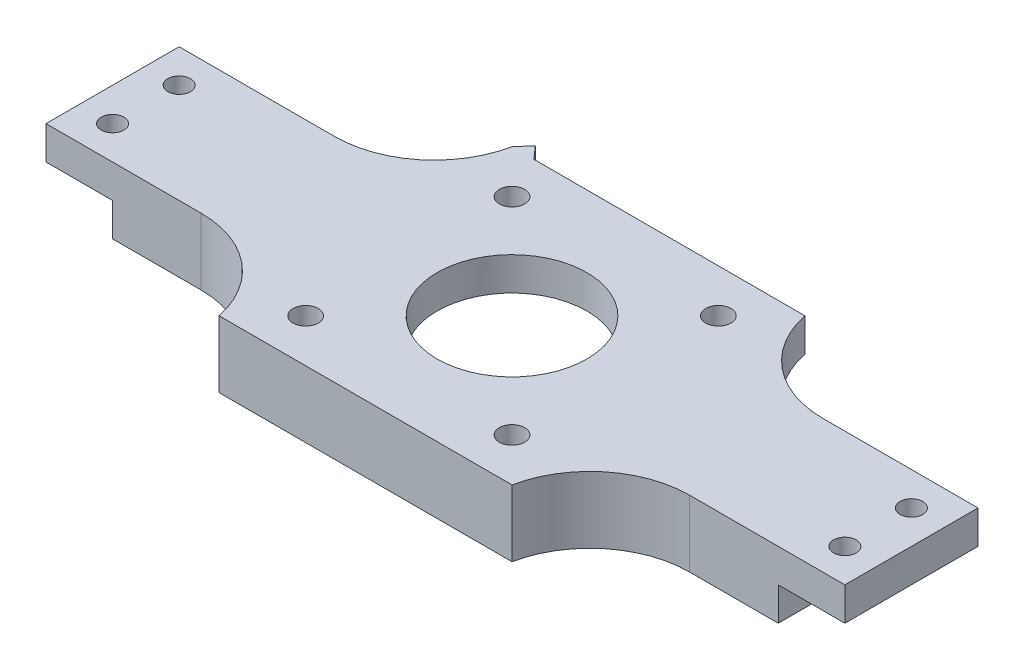
ISO-10303-21;
HEADER;
FILE_DESCRIPTION(('STEP AP214'),'2;1');
FILE_NAME('part.step','',(''),(''),'','','');
FILE_SCHEMA(('AUTOMOTIVE_DESIGN { 1 0 10303 214 1 1 1 1 }'));
ENDSEC;
DATA;
#1=APPLICATION_CONTEXT('core data for automotive mechanical design processes');
#2=APPLICATION_PROTOCOL_DEFINITION('international standard','automotive_design',2000,#1);
#3=PRODUCT_CONTEXT('',#1,'mechanical');
#4=PRODUCT('Part','Part','',(#3));
#5=PRODUCT_RELATED_PRODUCT_CATEGORY('part','',(#4));
#6=PRODUCT_DEFINITION_FORMATION('','',#4);
#7=PRODUCT_DEFINITION_CONTEXT('part definition',#1,'design');
#8=PRODUCT_DEFINITION('design','',#6,#7);
#9=PRODUCT_DEFINITION_SHAPE('','',#8);
#10=(LENGTH_UNIT() NAMED_UNIT(*) SI_UNIT(.MILLI.,.METRE.));
#11=(NAMED_UNIT(*) PLANE_ANGLE_UNIT() SI_UNIT($,.RADIAN.));
#12=(NAMED_UNIT(*) SI_UNIT($,.STERADIAN.) SOLID_ANGLE_UNIT());
#13=UNCERTAINTY_MEASURE_WITH_UNIT(LENGTH_MEASURE(1.E-05),#10,'distance_accuracy_value','');
#14=(GEOMETRIC_REPRESENTATION_CONTEXT(3) GLOBAL_UNCERTAINTY_ASSIGNED_CONTEXT((#13)) GLOBAL_UNIT_ASSIGNED_CONTEXT((#10,
#11,#12)) REPRESENTATION_CONTEXT('',''));
#15=CARTESIAN_POINT('',(0.,0.,0.));
#16=DIRECTION('',(0.,0.,1.));
#17=DIRECTION('',(1.,0.,0.));
#18=AXIS2_PLACEMENT_3D('',#15,#16,#17);
#19=CARTESIAN_POINT('',(22.,10.,4.8));
#20=DIRECTION('',(0.,0.,-1.));
#21=DIRECTION('',(-1.,0.,0.));
#22=AXIS2_PLACEMENT_3D('',#19,#20,#21);
#23=PLANE('',#22);
#24=DIRECTION('',(0.,1.,0.));
#25=VECTOR('',#24,1.);
#26=CARTESIAN_POINT('',(50.,10.,4.8));
#27=LINE('',#26,#25);
#28=CARTESIAN_POINT('',(50.,0.,4.8));
#29=VERTEX_POINT('',#28);
#30=CARTESIAN_POINT('',(50.,5.,4.8));
#31=VERTEX_POINT('',#30);
#32=EDGE_CURVE('E459',#29,#31,#27,.T.);
#33=ORIENTED_EDGE('',*,*,#32,.T.);
#34=DIRECTION('',(1.,0.,0.));
#35=VECTOR('',#34,1.);
#36=CARTESIAN_POINT('',(22.,5.,4.8));
#37=LINE('',#36,#35);
#38=CARTESIAN_POINT('',(60.,5.,4.8));
#39=VERTEX_POINT('',#38);
#40=EDGE_CURVE('E465',#31,#39,#37,.T.);
#41=ORIENTED_EDGE('',*,*,#40,.T.);
#42=DIRECTION('',(0.,-1.,0.));
#43=VECTOR('',#42,1.);
#44=CARTESIAN_POINT('',(60.,10.,4.8));
#45=LINE('',#44,#43);
#46=CARTESIAN_POINT('',(60.,10.,4.8));
#47=VERTEX_POINT('',#46);
#48=EDGE_CURVE('E316',#47,#39,#45,.T.);
#49=ORIENTED_EDGE('',*,*,#48,.F.);
#50=DIRECTION('',(1.,0.,0.));
#51=VECTOR('',#50,1.);
#52=CARTESIAN_POINT('',(22.,10.,4.8));
#53=LINE('',#52,#51);
#54=CARTESIAN_POINT('',(36.6969384566991,10.,4.8));
#55=VERTEX_POINT('',#54);
#56=EDGE_CURVE('E267',#55,#47,#53,.T.);
#57=ORIENTED_EDGE('',*,*,#56,.F.);
#58=DIRECTION('',(0.,-1.,0.));
#59=VECTOR('',#58,1.);
#60=CARTESIAN_POINT('',(36.6969384566991,10.,4.8));
#61=LINE('',#60,#59);
#62=CARTESIAN_POINT('',(36.6969384566991,0.,4.8));
#63=VERTEX_POINT('',#62);
#64=EDGE_CURVE('E326',#55,#63,#61,.T.);
#65=ORIENTED_EDGE('',*,*,#64,.T.);
#66=DIRECTION('',(1.,0.,0.));
#67=VECTOR('',#66,1.);
#68=CARTESIAN_POINT('',(22.,0.,4.8));
#69=LINE('',#68,#67);
#70=EDGE_CURVE('E266',#63,#29,#69,.T.);
#71=ORIENTED_EDGE('',*,*,#70,.T.);
#72=EDGE_LOOP('',(#33,#41,#49,#57,#65,#71));
#73=FACE_BOUND('',#72,.T.);
#74=ADVANCED_FACE('F37',(#73),#23,.F.);
#75=CARTESIAN_POINT('',(60.,10.,4.8));
#76=DIRECTION('',(-1.,0.,0.));
#77=DIRECTION('',(0.,0.,1.));
#78=AXIS2_PLACEMENT_3D('',#75,#76,#77);
#79=PLANE('',#78);
#80=ORIENTED_EDGE('',*,*,#48,.T.);
#81=DIRECTION('',(0.,0.,-1.));
#82=VECTOR('',#81,1.);
#83=CARTESIAN_POINT('',(60.,5.,16.8));
#84=LINE('',#83,#82);
#85=CARTESIAN_POINT('',(60.,5.,-15.2));
#86=VERTEX_POINT('',#85);
#87=EDGE_CURVE('E446',#39,#86,#84,.T.);
#88=ORIENTED_EDGE('',*,*,#87,.T.);
#89=DIRECTION('',(0.,-1.,0.));
#90=VECTOR('',#89,1.);
#91=CARTESIAN_POINT('',(60.,10.,-15.2));
#92=LINE('',#91,#90);
#93=CARTESIAN_POINT('',(60.,10.,-15.2));
#94=VERTEX_POINT('',#93);
#95=EDGE_CURVE('E313',#94,#86,#92,.T.);
#96=ORIENTED_EDGE('',*,*,#95,.F.);
#97=DIRECTION('',(0.,0.,-1.));
#98=VECTOR('',#97,1.);
#99=CARTESIAN_POINT('',(60.,10.,4.8));
#100=LINE('',#99,#98);
#101=EDGE_CURVE('E269',#47,#94,#100,.T.);
#102=ORIENTED_EDGE('',*,*,#101,.F.);
#103=EDGE_LOOP('',(#80,#88,#96,#102));
#104=FACE_BOUND('',#103,.T.);
#105=ADVANCED_FACE('F490',(#104),#79,.F.);
#106=CARTESIAN_POINT('',(60.,10.,-15.2));
#107=DIRECTION('',(0.,0.,1.));
#108=DIRECTION('',(1.,0.,0.));
#109=AXIS2_PLACEMENT_3D('',#106,#107,#108);
#110=PLANE('',#109);
#111=DIRECTION('',(-1.,0.,0.));
#112=VECTOR('',#111,1.);
#113=CARTESIAN_POINT('',(60.,0.,-15.2));
#114=LINE('',#113,#112);
#115=CARTESIAN_POINT('',(50.,0.,-15.2));
#116=VERTEX_POINT('',#115);
#117=CARTESIAN_POINT('',(36.3068699208122,0.,-15.2));
#118=VERTEX_POINT('',#117);
#119=EDGE_CURVE('E289',#116,#118,#114,.T.);
#120=ORIENTED_EDGE('',*,*,#119,.T.);
#121=DIRECTION('',(0.,1.,0.));
#122=VECTOR('',#121,1.);
#123=CARTESIAN_POINT('',(36.3068699208122,5.,-15.2));
#124=LINE('',#123,#122);
#125=CARTESIAN_POINT('',(36.3068699208122,5.,-15.2));
#126=VERTEX_POINT('',#125);
#127=EDGE_CURVE('E396',#118,#126,#124,.T.);
#128=ORIENTED_EDGE('',*,*,#127,.T.);
#129=DIRECTION('',(-1.,0.,0.));
#130=VECTOR('',#129,1.);
#131=CARTESIAN_POINT('',(60.,5.,-15.2));
#132=LINE('',#131,#130);
#133=CARTESIAN_POINT('',(36.6969384566991,5.,-15.2));
#134=VERTEX_POINT('',#133);
#135=EDGE_CURVE('E468',#134,#126,#132,.T.);
#136=ORIENTED_EDGE('',*,*,#135,.F.);
#137=DIRECTION('',(0.,1.,0.));
#138=VECTOR('',#137,1.);
#139=CARTESIAN_POINT('',(36.6969384566991,10.,-15.2));
#140=LINE('',#139,#138);
#141=CARTESIAN_POINT('',(36.6969384566991,10.,-15.2));
#142=VERTEX_POINT('',#141);
#143=EDGE_CURVE('E329',#134,#142,#140,.T.);
#144=ORIENTED_EDGE('',*,*,#143,.T.);
#145=DIRECTION('',(-1.,0.,0.));
#146=VECTOR('',#145,1.);
#147=CARTESIAN_POINT('',(60.,10.,-15.2));
#148=LINE('',#147,#146);
#149=EDGE_CURVE('E272',#94,#142,#148,.T.);
#150=ORIENTED_EDGE('',*,*,#149,.F.);
#151=ORIENTED_EDGE('',*,*,#95,.T.);
#152=DIRECTION('',(-1.,0.,0.));
#153=VECTOR('',#152,1.);
#154=CARTESIAN_POINT('',(60.,5.,-15.2));
#155=LINE('',#154,#153);
#156=CARTESIAN_POINT('',(50.,5.,-15.2));
#157=VERTEX_POINT('',#156);
#158=EDGE_CURVE('E357',#86,#157,#155,.T.);
#159=ORIENTED_EDGE('',*,*,#158,.T.);
#160=DIRECTION('',(0.,-1.,0.));
#161=VECTOR('',#160,1.);
#162=CARTESIAN_POINT('',(50.,10.,-15.2));
#163=LINE('',#162,#161);
#164=EDGE_CURVE('E448',#157,#116,#163,.T.);
#165=ORIENTED_EDGE('',*,*,#164,.T.);
#166=EDGE_LOOP('',(#120,#128,#136,#144,#150,#151,#159,#165));
#167=FACE_BOUND('',#166,.T.);
#168=ADVANCED_FACE('F474',(#167),#110,.F.);
#169=CARTESIAN_POINT('',(-22.,10.,-27.2));
#170=DIRECTION('',(0.,0.,1.));
#171=DIRECTION('',(1.,0.,0.));
#172=AXIS2_PLACEMENT_3D('',#169,#170,#171);
#173=PLANE('',#172);
#174=DIRECTION('',(-1.,0.,0.));
#175=VECTOR('',#174,1.);
#176=CARTESIAN_POINT('',(-22.,5.,-27.2));
#177=LINE('',#176,#175);
#178=CARTESIAN_POINT('',(22.,5.,-27.2));
#179=VERTEX_POINT('',#178);
#180=CARTESIAN_POINT('',(-18.7207327581259,5.,-27.2));
#181=VERTEX_POINT('',#180);
#182=EDGE_CURVE('E227',#179,#181,#177,.T.);
#183=ORIENTED_EDGE('',*,*,#182,.T.);
#184=DIRECTION('',(0.,1.,0.));
#185=VECTOR('',#184,1.);
#186=CARTESIAN_POINT('',(-18.7207327581259,5.,-27.2));
#187=LINE('',#186,#185);
#188=CARTESIAN_POINT('',(-18.7207327581259,10.,-27.2));
#189=VERTEX_POINT('',#188);
#190=EDGE_CURVE('E209',#181,#189,#187,.T.);
#191=ORIENTED_EDGE('',*,*,#190,.T.);
#192=DIRECTION('',(-1.,0.,0.));
#193=VECTOR('',#192,1.);
#194=CARTESIAN_POINT('',(0.,10.,-27.2));
#195=LINE('',#194,#193);
#196=CARTESIAN_POINT('',(22.,10.,-27.2));
#197=VERTEX_POINT('',#196);
#198=EDGE_CURVE('E275',#197,#189,#195,.T.);
#199=ORIENTED_EDGE('',*,*,#198,.F.);
#200=DIRECTION('',(0.,-1.,0.));
#201=VECTOR('',#200,1.);
#202=CARTESIAN_POINT('',(22.,10.,-27.2));
#203=LINE('',#202,#201);
#204=EDGE_CURVE('E234',#197,#179,#203,.T.);
#205=ORIENTED_EDGE('',*,*,#204,.T.);
#206=EDGE_LOOP('',(#183,#191,#199,#205));
#207=FACE_BOUND('',#206,.T.);
#208=ADVANCED_FACE('F232',(#207),#173,.F.);
#209=CARTESIAN_POINT('',(-22.,10.,-15.2));
#210=DIRECTION('',(0.,0.,1.));
#211=DIRECTION('',(1.,0.,0.));
#212=AXIS2_PLACEMENT_3D('',#209,#210,#211);
#213=PLANE('',#212);
#214=CARTESIAN_POINT('',(-36.3068699208122,5.,-15.2));
#215=VERTEX_POINT('',#214);
#216=CARTESIAN_POINT('',(-36.6969384566991,5.,-15.2));
#217=VERTEX_POINT('',#216);
#218=EDGE_CURVE('E435',#215,#217,#132,.T.);
#219=ORIENTED_EDGE('',*,*,#218,.F.);
#220=DIRECTION('',(0.,1.,0.));
#221=VECTOR('',#220,1.);
#222=CARTESIAN_POINT('',(-36.3068699208121,0.,-15.2));
#223=LINE('',#222,#221);
#224=CARTESIAN_POINT('',(-36.3068699208121,0.,-15.2));
#225=VERTEX_POINT('',#224);
#226=EDGE_CURVE('E393',#215,#225,#223,.F.);
#227=ORIENTED_EDGE('',*,*,#226,.T.);
#228=DIRECTION('',(-1.,0.,0.));
#229=VECTOR('',#228,1.);
#230=CARTESIAN_POINT('',(-22.,0.,-15.2));
#231=LINE('',#230,#229);
#232=CARTESIAN_POINT('',(-50.,0.,-15.2));
#233=VERTEX_POINT('',#232);
#234=EDGE_CURVE('E292',#225,#233,#231,.T.);
#235=ORIENTED_EDGE('',*,*,#234,.T.);
#236=DIRECTION('',(0.,1.,0.));
#237=VECTOR('',#236,1.);
#238=CARTESIAN_POINT('',(-50.,10.,-15.2));
#239=LINE('',#238,#237);
#240=CARTESIAN_POINT('',(-50.,5.,-15.2));
#241=VERTEX_POINT('',#240);
#242=EDGE_CURVE('E443',#233,#241,#239,.T.);
#243=ORIENTED_EDGE('',*,*,#242,.T.);
#244=DIRECTION('',(-1.,0.,0.));
#245=VECTOR('',#244,1.);
#246=CARTESIAN_POINT('',(-22.,5.,-15.2));
#247=LINE('',#246,#245);
#248=CARTESIAN_POINT('',(-60.,5.,-15.2));
#249=VERTEX_POINT('',#248);
#250=EDGE_CURVE('E462',#241,#249,#247,.T.);
#251=ORIENTED_EDGE('',*,*,#250,.T.);
#252=DIRECTION('',(0.,-1.,0.));
#253=VECTOR('',#252,1.);
#254=CARTESIAN_POINT('',(-60.,10.,-15.2));
#255=LINE('',#254,#253);
#256=CARTESIAN_POINT('',(-60.,10.,-15.2));
#257=VERTEX_POINT('',#256);
#258=EDGE_CURVE('E306',#257,#249,#255,.T.);
#259=ORIENTED_EDGE('',*,*,#258,.F.);
#260=DIRECTION('',(-1.,0.,0.));
#261=VECTOR('',#260,1.);
#262=CARTESIAN_POINT('',(-22.,10.,-15.2));
#263=LINE('',#262,#261);
#264=CARTESIAN_POINT('',(-36.6969384566991,10.,-15.2));
#265=VERTEX_POINT('',#264);
#266=EDGE_CURVE('E277',#265,#257,#263,.T.);
#267=ORIENTED_EDGE('',*,*,#266,.F.);
#268=DIRECTION('',(0.,-1.,0.));
#269=VECTOR('',#268,1.);
#270=CARTESIAN_POINT('',(-36.6969384566991,10.,-15.2));
#271=LINE('',#270,#269);
#272=EDGE_CURVE('E321',#265,#217,#271,.T.);
#273=ORIENTED_EDGE('',*,*,#272,.T.);
#274=EDGE_LOOP('',(#219,#227,#235,#243,#251,#259,#267,#273));
#275=FACE_BOUND('',#274,.T.);
#276=ADVANCED_FACE('F432',(#275),#213,.F.);
#277=CARTESIAN_POINT('',(-60.,10.,4.8));
#278=DIRECTION('',(1.,0.,0.));
#279=DIRECTION('',(0.,0.,-1.));
#280=AXIS2_PLACEMENT_3D('',#277,#278,#279);
#281=PLANE('',#280);
#282=ORIENTED_EDGE('',*,*,#258,.T.);
#283=DIRECTION('',(0.,0.,-1.));
#284=VECTOR('',#283,1.);
#285=CARTESIAN_POINT('',(-60.,5.,16.8));
#286=LINE('',#285,#284);
#287=CARTESIAN_POINT('',(-60.,5.,4.8));
#288=VERTEX_POINT('',#287);
#289=EDGE_CURVE('E454',#288,#249,#286,.T.);
#290=ORIENTED_EDGE('',*,*,#289,.F.);
#291=DIRECTION('',(0.,-1.,0.));
#292=VECTOR('',#291,1.);
#293=CARTESIAN_POINT('',(-60.,10.,4.8));
#294=LINE('',#293,#292);
#295=CARTESIAN_POINT('',(-60.,10.,4.8));
#296=VERTEX_POINT('',#295);
#297=EDGE_CURVE('E303',#296,#288,#294,.T.);
#298=ORIENTED_EDGE('',*,*,#297,.F.);
#299=DIRECTION('',(0.,0.,1.));
#300=VECTOR('',#299,1.);
#301=CARTESIAN_POINT('',(-60.,10.,4.8));
#302=LINE('',#301,#300);
#303=EDGE_CURVE('E279',#257,#296,#302,.T.);
#304=ORIENTED_EDGE('',*,*,#303,.F.);
#305=EDGE_LOOP('',(#282,#290,#298,#304));
#306=FACE_BOUND('',#305,.T.);
#307=ADVANCED_FACE('F557',(#306),#281,.F.);
#308=CARTESIAN_POINT('',(-60.,10.,4.8));
#309=DIRECTION('',(0.,0.,-1.));
#310=DIRECTION('',(-1.,0.,0.));
#311=AXIS2_PLACEMENT_3D('',#308,#309,#310);
#312=PLANE('',#311);
#313=DIRECTION('',(1.,0.,0.));
#314=VECTOR('',#313,1.);
#315=CARTESIAN_POINT('',(-60.,5.,4.8));
#316=LINE('',#315,#314);
#317=CARTESIAN_POINT('',(-50.,5.,4.8));
#318=VERTEX_POINT('',#317);
#319=EDGE_CURVE('E354',#288,#318,#316,.T.);
#320=ORIENTED_EDGE('',*,*,#319,.T.);
#321=DIRECTION('',(0.,-1.,0.));
#322=VECTOR('',#321,1.);
#323=CARTESIAN_POINT('',(-50.,10.,4.8));
#324=LINE('',#323,#322);
#325=CARTESIAN_POINT('',(-50.,0.,4.8));
#326=VERTEX_POINT('',#325);
#327=EDGE_CURVE('E441',#318,#326,#324,.T.);
#328=ORIENTED_EDGE('',*,*,#327,.T.);
#329=DIRECTION('',(1.,0.,0.));
#330=VECTOR('',#329,1.);
#331=CARTESIAN_POINT('',(-60.,0.,4.8));
#332=LINE('',#331,#330);
#333=CARTESIAN_POINT('',(-36.6969384566991,0.,4.8));
#334=VERTEX_POINT('',#333);
#335=EDGE_CURVE('E294',#326,#334,#332,.T.);
#336=ORIENTED_EDGE('',*,*,#335,.T.);
#337=DIRECTION('',(0.,1.,0.));
#338=VECTOR('',#337,1.);
#339=CARTESIAN_POINT('',(-36.6969384566991,10.,4.8));
#340=LINE('',#339,#338);
#341=CARTESIAN_POINT('',(-36.6969384566991,10.,4.8));
#342=VERTEX_POINT('',#341);
#343=EDGE_CURVE('E324',#334,#342,#340,.T.);
#344=ORIENTED_EDGE('',*,*,#343,.T.);
#345=DIRECTION('',(1.,0.,0.));
#346=VECTOR('',#345,1.);
#347=CARTESIAN_POINT('',(-60.,10.,4.8));
#348=LINE('',#347,#346);
#349=EDGE_CURVE('E281',#296,#342,#348,.T.);
#350=ORIENTED_EDGE('',*,*,#349,.F.);
#351=ORIENTED_EDGE('',*,*,#297,.T.);
#352=EDGE_LOOP('',(#320,#328,#336,#344,#350,#351));
#353=FACE_BOUND('',#352,.T.);
#354=ADVANCED_FACE('F445',(#353),#312,.F.);
#355=CARTESIAN_POINT('',(-22.,10.,16.8));
#356=DIRECTION('',(0.,0.,-1.));
#357=DIRECTION('',(-1.,0.,0.));
#358=AXIS2_PLACEMENT_3D('',#355,#356,#357);
#359=PLANE('',#358);
#360=DIRECTION('',(1.,0.,0.));
#361=VECTOR('',#360,1.);
#362=CARTESIAN_POINT('',(-22.,0.,16.8));
#363=LINE('',#362,#361);
#364=CARTESIAN_POINT('',(-22.,0.,16.8));
#365=VERTEX_POINT('',#364);
#366=CARTESIAN_POINT('',(22.,0.,16.8));
#367=VERTEX_POINT('',#366);
#368=EDGE_CURVE('E270',#365,#367,#363,.T.);
#369=ORIENTED_EDGE('',*,*,#368,.T.);
#370=DIRECTION('',(0.,-1.,0.));
#371=VECTOR('',#370,1.);
#372=CARTESIAN_POINT('',(22.,10.,16.8));
#373=LINE('',#372,#371);
#374=CARTESIAN_POINT('',(22.,10.,16.8));
#375=VERTEX_POINT('',#374);
#376=EDGE_CURVE('E286',#375,#367,#373,.T.);
#377=ORIENTED_EDGE('',*,*,#376,.F.);
#378=DIRECTION('',(1.,0.,0.));
#379=VECTOR('',#378,1.);
#380=CARTESIAN_POINT('',(-22.,10.,16.8));
#381=LINE('',#380,#379);
#382=CARTESIAN_POINT('',(-22.,10.,16.8));
#383=VERTEX_POINT('',#382);
#384=EDGE_CURVE('E284',#383,#375,#381,.T.);
#385=ORIENTED_EDGE('',*,*,#384,.F.);
#386=DIRECTION('',(0.,-1.,0.));
#387=VECTOR('',#386,1.);
#388=CARTESIAN_POINT('',(-22.,10.,16.8));
#389=LINE('',#388,#387);
#390=EDGE_CURVE('E300',#383,#365,#389,.T.);
#391=ORIENTED_EDGE('',*,*,#390,.T.);
#392=EDGE_LOOP('',(#369,#377,#385,#391));
#393=FACE_BOUND('',#392,.T.);
#394=ADVANCED_FACE('F544',(#393),#359,.F.);
#395=CARTESIAN_POINT('',(0.,10.,0.));
#396=DIRECTION('',(0.,1.,0.));
#397=DIRECTION('',(0.,0.,1.));
#398=AXIS2_PLACEMENT_3D('',#395,#396,#397);
#399=PLANE('',#398);
#400=CARTESIAN_POINT('',(55.,10.,-0.199999999999988));
#401=DIRECTION('',(0.,1.,0.));
#402=DIRECTION('',(0.,0.,1.));
#403=AXIS2_PLACEMENT_3D('',#400,#401,#402);
#404=CIRCLE('',#403,1.7);
#405=CARTESIAN_POINT('',(55.,10.,1.50000000000001));
#406=VERTEX_POINT('',#405);
#407=EDGE_CURVE('E567',#406,#406,#404,.T.);
#408=ORIENTED_EDGE('',*,*,#407,.F.);
#409=EDGE_LOOP('',(#408));
#410=FACE_BOUND('',#409,.T.);
#411=CARTESIAN_POINT('',(55.,10.,-10.2));
#412=DIRECTION('',(0.,1.,0.));
#413=DIRECTION('',(0.,0.,1.));
#414=AXIS2_PLACEMENT_3D('',#411,#412,#413);
#415=CIRCLE('',#414,1.7);
#416=CARTESIAN_POINT('',(55.,10.,-8.49999999999999));
#417=VERTEX_POINT('',#416);
#418=EDGE_CURVE('E573',#417,#417,#415,.T.);
#419=ORIENTED_EDGE('',*,*,#418,.F.);
#420=EDGE_LOOP('',(#419));
#421=FACE_BOUND('',#420,.T.);
#422=CARTESIAN_POINT('',(-55.,10.,-10.2));
#423=DIRECTION('',(0.,1.,0.));
#424=DIRECTION('',(0.,0.,1.));
#425=AXIS2_PLACEMENT_3D('',#422,#423,#424);
#426=CIRCLE('',#425,1.7);
#427=CARTESIAN_POINT('',(-55.,10.,-8.5));
#428=VERTEX_POINT('',#427);
#429=EDGE_CURVE('E560',#428,#428,#426,.T.);
#430=ORIENTED_EDGE('',*,*,#429,.F.);
#431=EDGE_LOOP('',(#430));
#432=FACE_BOUND('',#431,.T.);
#433=CARTESIAN_POINT('',(-55.,10.,-0.200000000000001));
#434=DIRECTION('',(0.,1.,0.));
#435=DIRECTION('',(0.,0.,1.));
#436=AXIS2_PLACEMENT_3D('',#433,#434,#435);
#437=CIRCLE('',#436,1.7);
#438=CARTESIAN_POINT('',(-55.,10.,1.5));
#439=VERTEX_POINT('',#438);
#440=EDGE_CURVE('E562',#439,#439,#437,.T.);
#441=ORIENTED_EDGE('',*,*,#440,.F.);
#442=EDGE_LOOP('',(#441));
#443=FACE_BOUND('',#442,.T.);
#444=CARTESIAN_POINT('',(0.,10.,-5.2));
#445=DIRECTION('',(0.,1.,0.));
#446=DIRECTION('',(0.,0.,1.));
#447=AXIS2_PLACEMENT_3D('',#444,#445,#446);
#448=CIRCLE('',#447,11.25);
#449=CARTESIAN_POINT('',(0.,10.,6.05));
#450=VERTEX_POINT('',#449);
#451=EDGE_CURVE('E235',#450,#450,#448,.T.);
#452=ORIENTED_EDGE('',*,*,#451,.F.);
#453=EDGE_LOOP('',(#452));
#454=FACE_BOUND('',#453,.T.);
#455=CARTESIAN_POINT('',(-15.5,10.,-20.7));
#456=DIRECTION('',(0.,1.,0.));
#457=DIRECTION('',(0.,0.,1.));
#458=AXIS2_PLACEMENT_3D('',#455,#456,#457);
#459=CIRCLE('',#458,1.9);
#460=CARTESIAN_POINT('',(-15.5,10.,-18.8));
#461=VERTEX_POINT('',#460);
#462=EDGE_CURVE('E259',#461,#461,#459,.T.);
#463=ORIENTED_EDGE('',*,*,#462,.F.);
#464=EDGE_LOOP('',(#463));
#465=FACE_BOUND('',#464,.T.);
#466=CARTESIAN_POINT('',(-15.5,10.,10.3));
#467=DIRECTION('',(0.,1.,0.));
#468=DIRECTION('',(0.,0.,1.));
#469=AXIS2_PLACEMENT_3D('',#466,#467,#468);
#470=CIRCLE('',#469,1.9);
#471=CARTESIAN_POINT('',(-15.5,10.,12.2));
#472=VERTEX_POINT('',#471);
#473=EDGE_CURVE('E256',#472,#472,#470,.T.);
#474=ORIENTED_EDGE('',*,*,#473,.F.);
#475=EDGE_LOOP('',(#474));
#476=FACE_BOUND('',#475,.T.);
#477=CARTESIAN_POINT('',(15.5,10.,10.3));
#478=DIRECTION('',(0.,1.,0.));
#479=DIRECTION('',(0.,0.,1.));
#480=AXIS2_PLACEMENT_3D('',#477,#478,#479);
#481=CIRCLE('',#480,1.9);
#482=CARTESIAN_POINT('',(15.5,10.,12.2));
#483=VERTEX_POINT('',#482);
#484=EDGE_CURVE('E250',#483,#483,#481,.T.);
#485=ORIENTED_EDGE('',*,*,#484,.F.);
#486=EDGE_LOOP('',(#485));
#487=FACE_BOUND('',#486,.T.);
#488=CARTESIAN_POINT('',(15.5,10.,-20.7));
#489=DIRECTION('',(0.,1.,0.));
#490=DIRECTION('',(0.,0.,1.));
#491=AXIS2_PLACEMENT_3D('',#488,#489,#490);
#492=CIRCLE('',#491,1.9);
#493=CARTESIAN_POINT('',(15.5,10.,-18.8));
#494=VERTEX_POINT('',#493);
#495=EDGE_CURVE('E249',#494,#494,#492,.T.);
#496=ORIENTED_EDGE('',*,*,#495,.F.);
#497=EDGE_LOOP('',(#496));
#498=FACE_BOUND('',#497,.T.);
#499=ORIENTED_EDGE('',*,*,#384,.T.);
#500=CARTESIAN_POINT('',(36.6969384566991,10.,19.8));
#501=DIRECTION('',(0.,1.,0.));
#502=DIRECTION('',(0.,0.,1.));
#503=AXIS2_PLACEMENT_3D('',#500,#501,#502);
#504=CIRCLE('',#503,15.);
#505=EDGE_CURVE('E342',#375,#55,#504,.F.);
#506=ORIENTED_EDGE('',*,*,#505,.T.);
#507=ORIENTED_EDGE('',*,*,#56,.T.);
#508=ORIENTED_EDGE('',*,*,#101,.T.);
#509=ORIENTED_EDGE('',*,*,#149,.T.);
#510=CARTESIAN_POINT('',(36.6969384566991,10.,-30.2));
#511=DIRECTION('',(0.,1.,0.));
#512=DIRECTION('',(0.,0.,1.));
#513=AXIS2_PLACEMENT_3D('',#510,#511,#512);
#514=CIRCLE('',#513,15.);
#515=EDGE_CURVE('E346',#142,#197,#514,.F.);
#516=ORIENTED_EDGE('',*,*,#515,.T.);
#517=ORIENTED_EDGE('',*,*,#198,.T.);
#518=DIRECTION('',(-0.659629993189365,0.,-0.751590494940561));
#519=VECTOR('',#518,1.);
#520=CARTESIAN_POINT('',(-18.7207327581259,10.,-27.2));
#521=LINE('',#520,#519);
#522=CARTESIAN_POINT('',(-20.3603663790629,10.,-29.0682186337872));
#523=VERTEX_POINT('',#522);
#524=EDGE_CURVE('E215',#189,#523,#521,.T.);
#525=ORIENTED_EDGE('',*,*,#524,.T.);
#526=DIRECTION('',(-0.659629993189365,0.,0.751590494940561));
#527=VECTOR('',#526,1.);
#528=CARTESIAN_POINT('',(-22.,10.,-27.2));
#529=LINE('',#528,#527);
#530=CARTESIAN_POINT('',(-22.,10.,-27.2));
#531=VERTEX_POINT('',#530);
#532=EDGE_CURVE('E230',#523,#531,#529,.T.);
#533=ORIENTED_EDGE('',*,*,#532,.T.);
#534=CARTESIAN_POINT('',(-36.6969384566991,10.,-30.2));
#535=DIRECTION('',(0.,1.,0.));
#536=DIRECTION('',(0.,0.,1.));
#537=AXIS2_PLACEMENT_3D('',#534,#535,#536);
#538=CIRCLE('',#537,15.);
#539=EDGE_CURVE('E333',#531,#265,#538,.F.);
#540=ORIENTED_EDGE('',*,*,#539,.T.);
#541=ORIENTED_EDGE('',*,*,#266,.T.);
#542=ORIENTED_EDGE('',*,*,#303,.T.);
#543=ORIENTED_EDGE('',*,*,#349,.T.);
#544=CARTESIAN_POINT('',(-36.6969384566991,10.,19.8));
#545=DIRECTION('',(0.,1.,0.));
#546=DIRECTION('',(0.,0.,1.));
#547=AXIS2_PLACEMENT_3D('',#544,#545,#546);
#548=CIRCLE('',#547,15.);
#549=EDGE_CURVE('E338',#342,#383,#548,.F.);
#550=ORIENTED_EDGE('',*,*,#549,.T.);
#551=EDGE_LOOP('',(#499,#506,#507,#508,#509,#516,#517,#525,#533,#540,#541,#542,#543,#550));
#552=FACE_BOUND('',#551,.T.);
#553=ADVANCED_FACE('F528',(#410,#421,#432,#443,#454,#465,#476,#487,#498,#552),#399,.T.);
#554=CARTESIAN_POINT('',(0.,0.,0.));
#555=DIRECTION('',(0.,1.,0.));
#556=DIRECTION('',(0.,0.,1.));
#557=AXIS2_PLACEMENT_3D('',#554,#555,#556);
#558=PLANE('',#557);
#559=DIRECTION('',(-0.819152044288993,0.,-0.573576436351044));
#560=VECTOR('',#559,1.);
#561=CARTESIAN_POINT('',(-8.7185603500619,0.,1.90979644028776));
#562=LINE('',#561,#560);
#563=CARTESIAN_POINT('',(-30.5711055573017,0.,-13.3915204428899));
#564=VERTEX_POINT('',#563);
#565=CARTESIAN_POINT('',(-9.67372325216649,0.,1.24098417601586));
#566=VERTEX_POINT('',#565);
#567=EDGE_CURVE('E363',#564,#566,#562,.F.);
#568=ORIENTED_EDGE('',*,*,#567,.T.);
#569=CARTESIAN_POINT('',(-15.4094876156769,0.,9.43250461890579));
#570=DIRECTION('',(0.,1.,0.));
#571=DIRECTION('',(0.,0.,1.));
#572=AXIS2_PLACEMENT_3D('',#569,#570,#571);
#573=CIRCLE('',#572,10.);
#574=CARTESIAN_POINT('',(-8.15796403182896,0.,2.54662009236189));
#575=VERTEX_POINT('',#574);
#576=EDGE_CURVE('E387',#566,#575,#573,.F.);
#577=ORIENTED_EDGE('',*,*,#576,.T.);
#578=CARTESIAN_POINT('',(0.,0.,-5.2));
#579=DIRECTION('',(0.,1.,0.));
#580=DIRECTION('',(0.,0.,1.));
#581=AXIS2_PLACEMENT_3D('',#578,#579,#580);
#582=CIRCLE('',#581,11.25);
#583=CARTESIAN_POINT('',(8.15796403182892,0.,2.54662009236193));
#584=VERTEX_POINT('',#583);
#585=EDGE_CURVE('E239',#575,#584,#582,.T.);
#586=ORIENTED_EDGE('',*,*,#585,.T.);
#587=CARTESIAN_POINT('',(15.4094876156769,0.,9.43250461890588));
#588=DIRECTION('',(0.,1.,0.));
#589=DIRECTION('',(0.,0.,1.));
#590=AXIS2_PLACEMENT_3D('',#587,#588,#589);
#591=CIRCLE('',#590,10.);
#592=CARTESIAN_POINT('',(9.67372325216641,0.,1.24098417601594));
#593=VERTEX_POINT('',#592);
#594=EDGE_CURVE('E385',#584,#593,#591,.F.);
#595=ORIENTED_EDGE('',*,*,#594,.T.);
#596=DIRECTION('',(0.819152044288993,0.,-0.573576436351044));
#597=VECTOR('',#596,1.);
#598=CARTESIAN_POINT('',(8.71856035006187,0.,1.9097964402878));
#599=LINE('',#598,#597);
#600=CARTESIAN_POINT('',(30.5711055573018,0.,-13.3915204428899));
#601=VERTEX_POINT('',#600);
#602=EDGE_CURVE('E360',#593,#601,#599,.T.);
#603=ORIENTED_EDGE('',*,*,#602,.T.);
#604=CARTESIAN_POINT('',(36.3068699208122,0.,-5.2));
#605=DIRECTION('',(0.,1.,0.));
#606=DIRECTION('',(0.,0.,1.));
#607=AXIS2_PLACEMENT_3D('',#604,#605,#606);
#608=CIRCLE('',#607,10.);
#609=EDGE_CURVE('E381',#601,#118,#608,.F.);
#610=ORIENTED_EDGE('',*,*,#609,.T.);
#611=ORIENTED_EDGE('',*,*,#119,.F.);
#612=DIRECTION('',(0.,0.,1.));
#613=VECTOR('',#612,1.);
#614=CARTESIAN_POINT('',(50.,0.,0.));
#615=LINE('',#614,#613);
#616=EDGE_CURVE('E351',#116,#29,#615,.T.);
#617=ORIENTED_EDGE('',*,*,#616,.T.);
#618=ORIENTED_EDGE('',*,*,#70,.F.);
#619=CARTESIAN_POINT('',(36.6969384566991,0.,19.8));
#620=DIRECTION('',(0.,1.,0.));
#621=DIRECTION('',(0.,0.,1.));
#622=AXIS2_PLACEMENT_3D('',#619,#620,#621);
#623=CIRCLE('',#622,15.);
#624=EDGE_CURVE('E340',#63,#367,#623,.T.);
#625=ORIENTED_EDGE('',*,*,#624,.T.);
#626=ORIENTED_EDGE('',*,*,#368,.F.);
#627=CARTESIAN_POINT('',(-36.6969384566991,0.,19.8));
#628=DIRECTION('',(0.,1.,0.));
#629=DIRECTION('',(0.,0.,1.));
#630=AXIS2_PLACEMENT_3D('',#627,#628,#629);
#631=CIRCLE('',#630,15.);
#632=EDGE_CURVE('E335',#365,#334,#631,.T.);
#633=ORIENTED_EDGE('',*,*,#632,.T.);
#634=ORIENTED_EDGE('',*,*,#335,.F.);
#635=DIRECTION('',(0.,0.,-1.));
#636=VECTOR('',#635,1.);
#637=CARTESIAN_POINT('',(-50.,0.,0.));
#638=LINE('',#637,#636);
#639=EDGE_CURVE('E348',#326,#233,#638,.T.);
#640=ORIENTED_EDGE('',*,*,#639,.T.);
#641=ORIENTED_EDGE('',*,*,#234,.F.);
#642=CARTESIAN_POINT('',(-36.3068699208121,0.,-5.2));
#643=DIRECTION('',(0.,1.,0.));
#644=DIRECTION('',(0.,0.,1.));
#645=AXIS2_PLACEMENT_3D('',#642,#643,#644);
#646=CIRCLE('',#645,10.);
#647=EDGE_CURVE('E383',#225,#564,#646,.F.);
#648=ORIENTED_EDGE('',*,*,#647,.T.);
#649=EDGE_LOOP('',(#568,#577,#586,#595,#603,#610,#611,#617,#618,#625,#626,#633,#634,#640,#641,#648));
#650=FACE_BOUND('',#649,.T.);
#651=CARTESIAN_POINT('',(-15.5,0.,10.3));
#652=DIRECTION('',(0.,1.,0.));
#653=DIRECTION('',(0.,0.,1.));
#654=AXIS2_PLACEMENT_3D('',#651,#652,#653);
#655=CIRCLE('',#654,1.9);
#656=CARTESIAN_POINT('',(-15.5,0.,12.2));
#657=VERTEX_POINT('',#656);
#658=EDGE_CURVE('E253',#657,#657,#655,.T.);
#659=ORIENTED_EDGE('',*,*,#658,.T.);
#660=EDGE_LOOP('',(#659));
#661=FACE_BOUND('',#660,.T.);
#662=CARTESIAN_POINT('',(15.5,0.,10.3));
#663=DIRECTION('',(0.,1.,0.));
#664=DIRECTION('',(0.,0.,1.));
#665=AXIS2_PLACEMENT_3D('',#662,#663,#664);
#666=CIRCLE('',#665,1.9);
#667=CARTESIAN_POINT('',(15.5,0.,12.2));
#668=VERTEX_POINT('',#667);
#669=EDGE_CURVE('E246',#668,#668,#666,.T.);
#670=ORIENTED_EDGE('',*,*,#669,.T.);
#671=EDGE_LOOP('',(#670));
#672=FACE_BOUND('',#671,.T.);
#673=ADVANCED_FACE('F415',(#650,#661,#672),#558,.F.);
#674=CARTESIAN_POINT('',(15.5,0.,-20.7));
#675=DIRECTION('',(0.,1.,0.));
#676=DIRECTION('',(0.,0.,1.));
#677=AXIS2_PLACEMENT_3D('',#674,#675,#676);
#678=CYLINDRICAL_SURFACE('',#677,1.9);
#679=CARTESIAN_POINT('',(15.5,5.,-20.7));
#680=DIRECTION('',(0.,1.,0.));
#681=DIRECTION('',(0.,0.,1.));
#682=AXIS2_PLACEMENT_3D('',#679,#680,#681);
#683=CIRCLE('',#682,1.9);
#684=CARTESIAN_POINT('',(15.5,5.,-18.8));
#685=VERTEX_POINT('',#684);
#686=EDGE_CURVE('E236',#685,#685,#683,.F.);
#687=ORIENTED_EDGE('',*,*,#686,.T.);
#688=EDGE_LOOP('',(#687));
#689=FACE_BOUND('',#688,.T.);
#690=ORIENTED_EDGE('',*,*,#495,.T.);
#691=EDGE_LOOP('',(#690));
#692=FACE_BOUND('',#691,.T.);
#693=ADVANCED_FACE('F634',(#689,#692),#678,.F.);
#694=CARTESIAN_POINT('',(15.5,0.,10.3));
#695=DIRECTION('',(0.,1.,0.));
#696=DIRECTION('',(0.,0.,1.));
#697=AXIS2_PLACEMENT_3D('',#694,#695,#696);
#698=CYLINDRICAL_SURFACE('',#697,1.9);
#699=ORIENTED_EDGE('',*,*,#669,.F.);
#700=EDGE_LOOP('',(#699));
#701=FACE_BOUND('',#700,.T.);
#702=ORIENTED_EDGE('',*,*,#484,.T.);
#703=EDGE_LOOP('',(#702));
#704=FACE_BOUND('',#703,.T.);
#705=ADVANCED_FACE('F630',(#701,#704),#698,.F.);
#706=CARTESIAN_POINT('',(-15.5,0.,10.3));
#707=DIRECTION('',(0.,1.,0.));
#708=DIRECTION('',(0.,0.,1.));
#709=AXIS2_PLACEMENT_3D('',#706,#707,#708);
#710=CYLINDRICAL_SURFACE('',#709,1.9);
#711=ORIENTED_EDGE('',*,*,#658,.F.);
#712=EDGE_LOOP('',(#711));
#713=FACE_BOUND('',#712,.T.);
#714=ORIENTED_EDGE('',*,*,#473,.T.);
#715=EDGE_LOOP('',(#714));
#716=FACE_BOUND('',#715,.T.);
#717=ADVANCED_FACE('F633',(#713,#716),#710,.F.);
#718=CARTESIAN_POINT('',(-15.5,0.,-20.7));
#719=DIRECTION('',(0.,1.,0.));
#720=DIRECTION('',(0.,0.,1.));
#721=AXIS2_PLACEMENT_3D('',#718,#719,#720);
#722=CYLINDRICAL_SURFACE('',#721,1.9);
#723=CARTESIAN_POINT('',(-15.5,5.,-20.7));
#724=DIRECTION('',(0.,1.,0.));
#725=DIRECTION('',(0.,0.,1.));
#726=AXIS2_PLACEMENT_3D('',#723,#724,#725);
#727=CIRCLE('',#726,1.9);
#728=CARTESIAN_POINT('',(-15.5,5.,-18.8));
#729=VERTEX_POINT('',#728);
#730=EDGE_CURVE('E242',#729,#729,#727,.F.);
#731=ORIENTED_EDGE('',*,*,#730,.T.);
#732=EDGE_LOOP('',(#731));
#733=FACE_BOUND('',#732,.T.);
#734=ORIENTED_EDGE('',*,*,#462,.T.);
#735=EDGE_LOOP('',(#734));
#736=FACE_BOUND('',#735,.T.);
#737=ADVANCED_FACE('F638',(#733,#736),#722,.F.);
#738=CARTESIAN_POINT('',(0.,0.,-5.2));
#739=DIRECTION('',(0.,1.,0.));
#740=DIRECTION('',(0.,0.,1.));
#741=AXIS2_PLACEMENT_3D('',#738,#739,#740);
#742=CYLINDRICAL_SURFACE('',#741,11.25);
#743=ORIENTED_EDGE('',*,*,#585,.F.);
#744=DIRECTION('',(0.,1.,0.));
#745=VECTOR('',#744,1.);
#746=CARTESIAN_POINT('',(-8.15796403182896,0.,2.54662009236189));
#747=LINE('',#746,#745);
#748=CARTESIAN_POINT('',(-8.15796403182896,5.,2.54662009236189));
#749=VERTEX_POINT('',#748);
#750=EDGE_CURVE('E374',#575,#749,#747,.T.);
#751=ORIENTED_EDGE('',*,*,#750,.T.);
#752=CARTESIAN_POINT('',(0.,5.,-5.2));
#753=DIRECTION('',(0.,1.,0.));
#754=DIRECTION('',(0.,0.,1.));
#755=AXIS2_PLACEMENT_3D('',#752,#753,#754);
#756=CIRCLE('',#755,11.25);
#757=CARTESIAN_POINT('',(8.15796403182892,5.,2.54662009236193));
#758=VERTEX_POINT('',#757);
#759=EDGE_CURVE('E319',#749,#758,#756,.F.);
#760=ORIENTED_EDGE('',*,*,#759,.T.);
#761=DIRECTION('',(0.,1.,0.));
#762=VECTOR('',#761,1.);
#763=CARTESIAN_POINT('',(8.15796403182892,0.,2.54662009236193));
#764=LINE('',#763,#762);
#765=EDGE_CURVE('E371',#758,#584,#764,.F.);
#766=ORIENTED_EDGE('',*,*,#765,.T.);
#767=EDGE_LOOP('',(#743,#751,#760,#766));
#768=FACE_BOUND('',#767,.T.);
#769=ORIENTED_EDGE('',*,*,#451,.T.);
#770=EDGE_LOOP('',(#769));
#771=FACE_BOUND('',#770,.T.);
#772=ADVANCED_FACE('F411',(#768,#771),#742,.F.);
#773=CARTESIAN_POINT('',(60.,5.,-36.0808213793679));
#774=DIRECTION('',(0.,1.,0.));
#775=DIRECTION('',(0.,0.,1.));
#776=AXIS2_PLACEMENT_3D('',#773,#774,#775);
#777=PLANE('',#776);
#778=ORIENTED_EDGE('',*,*,#730,.F.);
#779=EDGE_LOOP('',(#778));
#780=FACE_BOUND('',#779,.T.);
#781=ORIENTED_EDGE('',*,*,#686,.F.);
#782=EDGE_LOOP('',(#781));
#783=FACE_BOUND('',#782,.T.);
#784=ORIENTED_EDGE('',*,*,#135,.T.);
#785=CARTESIAN_POINT('',(36.3068699208122,5.,-5.2));
#786=DIRECTION('',(0.,1.,0.));
#787=DIRECTION('',(0.,0.,1.));
#788=AXIS2_PLACEMENT_3D('',#785,#786,#787);
#789=CIRCLE('',#788,10.);
#790=CARTESIAN_POINT('',(30.5711055573018,5.,-13.3915204428899));
#791=VERTEX_POINT('',#790);
#792=EDGE_CURVE('E12',#126,#791,#789,.T.);
#793=ORIENTED_EDGE('',*,*,#792,.T.);
#794=DIRECTION('',(-0.819152044288993,0.,0.573576436351044));
#795=VECTOR('',#794,1.);
#796=CARTESIAN_POINT('',(60.9786744566543,5.,-34.6831294048476));
#797=LINE('',#796,#795);
#798=CARTESIAN_POINT('',(9.6737232521664,5.,1.24098417601595));
#799=VERTEX_POINT('',#798);
#800=EDGE_CURVE('E368',#791,#799,#797,.T.);
#801=ORIENTED_EDGE('',*,*,#800,.T.);
#802=CARTESIAN_POINT('',(15.4094876156769,5.,9.43250461890588));
#803=DIRECTION('',(0.,1.,0.));
#804=DIRECTION('',(0.,0.,1.));
#805=AXIS2_PLACEMENT_3D('',#802,#803,#804);
#806=CIRCLE('',#805,10.);
#807=EDGE_CURVE('E400',#799,#758,#806,.T.);
#808=ORIENTED_EDGE('',*,*,#807,.T.);
#809=ORIENTED_EDGE('',*,*,#759,.F.);
#810=CARTESIAN_POINT('',(-15.4094876156769,5.,9.43250461890579));
#811=DIRECTION('',(0.,1.,0.));
#812=DIRECTION('',(0.,0.,1.));
#813=AXIS2_PLACEMENT_3D('',#810,#811,#812);
#814=CIRCLE('',#813,10.);
#815=CARTESIAN_POINT('',(-9.67372325216651,5.,1.24098417601588));
#816=VERTEX_POINT('',#815);
#817=EDGE_CURVE('E398',#749,#816,#814,.T.);
#818=ORIENTED_EDGE('',*,*,#817,.T.);
#819=DIRECTION('',(0.819152044288993,0.,0.573576436351044));
#820=VECTOR('',#819,1.);
#821=CARTESIAN_POINT('',(19.5425341428861,5.,21.6984278423068));
#822=LINE('',#821,#820);
#823=CARTESIAN_POINT('',(-30.5711055573017,5.,-13.3915204428899));
#824=VERTEX_POINT('',#823);
#825=EDGE_CURVE('E366',#816,#824,#822,.F.);
#826=ORIENTED_EDGE('',*,*,#825,.T.);
#827=CARTESIAN_POINT('',(-36.3068699208121,5.,-5.2));
#828=DIRECTION('',(0.,1.,0.));
#829=DIRECTION('',(0.,0.,1.));
#830=AXIS2_PLACEMENT_3D('',#827,#828,#829);
#831=CIRCLE('',#830,10.);
#832=EDGE_CURVE('E45',#824,#215,#831,.T.);
#833=ORIENTED_EDGE('',*,*,#832,.T.);
#834=ORIENTED_EDGE('',*,*,#218,.T.);
#835=CARTESIAN_POINT('',(-36.6969384566991,5.,-30.2));
#836=DIRECTION('',(0.,1.,0.));
#837=DIRECTION('',(0.,0.,1.));
#838=AXIS2_PLACEMENT_3D('',#835,#836,#837);
#839=CIRCLE('',#838,15.);
#840=CARTESIAN_POINT('',(-22.,5.,-27.2));
#841=VERTEX_POINT('',#840);
#842=EDGE_CURVE('E331',#217,#841,#839,.T.);
#843=ORIENTED_EDGE('',*,*,#842,.T.);
#844=DIRECTION('',(-0.659629993189365,0.,0.751590494940561));
#845=VECTOR('',#844,1.);
#846=CARTESIAN_POINT('',(-22.,5.,-27.2));
#847=LINE('',#846,#845);
#848=CARTESIAN_POINT('',(-20.3603663790629,5.,-29.0682186337872));
#849=VERTEX_POINT('',#848);
#850=EDGE_CURVE('E221',#849,#841,#847,.T.);
#851=ORIENTED_EDGE('',*,*,#850,.F.);
#852=DIRECTION('',(-0.659629993189365,0.,-0.751590494940561));
#853=VECTOR('',#852,1.);
#854=CARTESIAN_POINT('',(-18.7207327581259,5.,-27.2));
#855=LINE('',#854,#853);
#856=EDGE_CURVE('E212',#181,#849,#855,.T.);
#857=ORIENTED_EDGE('',*,*,#856,.F.);
#858=ORIENTED_EDGE('',*,*,#182,.F.);
#859=CARTESIAN_POINT('',(36.6969384566991,5.,-30.2));
#860=DIRECTION('',(0.,1.,0.));
#861=DIRECTION('',(0.,0.,1.));
#862=AXIS2_PLACEMENT_3D('',#859,#860,#861);
#863=CIRCLE('',#862,15.);
#864=EDGE_CURVE('E344',#179,#134,#863,.T.);
#865=ORIENTED_EDGE('',*,*,#864,.T.);
#866=EDGE_LOOP('',(#784,#793,#801,#808,#809,#818,#826,#833,#834,#843,#851,#857,#858,#865));
#867=FACE_BOUND('',#866,.T.);
#868=ADVANCED_FACE('F225',(#780,#783,#867),#777,.F.);
#869=CARTESIAN_POINT('',(-36.6969384566991,10.,-30.2));
#870=DIRECTION('',(0.,-1.,0.));
#871=DIRECTION('',(0.,0.,-1.));
#872=AXIS2_PLACEMENT_3D('',#869,#870,#871);
#873=CYLINDRICAL_SURFACE('',#872,15.);
#874=ORIENTED_EDGE('',*,*,#539,.F.);
#875=DIRECTION('',(0.,-1.,0.));
#876=VECTOR('',#875,1.);
#877=CARTESIAN_POINT('',(-22.,10.,-27.2));
#878=LINE('',#877,#876);
#879=EDGE_CURVE('E309',#531,#841,#878,.T.);
#880=ORIENTED_EDGE('',*,*,#879,.T.);
#881=ORIENTED_EDGE('',*,*,#842,.F.);
#882=ORIENTED_EDGE('',*,*,#272,.F.);
#883=EDGE_LOOP('',(#874,#880,#881,#882));
#884=FACE_BOUND('',#883,.T.);
#885=ADVANCED_FACE('F500',(#884),#873,.F.);
#886=CARTESIAN_POINT('',(-36.6969384566991,10.,19.8));
#887=DIRECTION('',(0.,1.,0.));
#888=DIRECTION('',(0.,0.,1.));
#889=AXIS2_PLACEMENT_3D('',#886,#887,#888);
#890=CYLINDRICAL_SURFACE('',#889,15.);
#891=ORIENTED_EDGE('',*,*,#549,.F.);
#892=ORIENTED_EDGE('',*,*,#343,.F.);
#893=ORIENTED_EDGE('',*,*,#632,.F.);
#894=ORIENTED_EDGE('',*,*,#390,.F.);
#895=EDGE_LOOP('',(#891,#892,#893,#894));
#896=FACE_BOUND('',#895,.T.);
#897=ADVANCED_FACE('F503',(#896),#890,.F.);
#898=CARTESIAN_POINT('',(36.6969384566991,10.,19.8));
#899=DIRECTION('',(0.,-1.,0.));
#900=DIRECTION('',(0.,0.,-1.));
#901=AXIS2_PLACEMENT_3D('',#898,#899,#900);
#902=CYLINDRICAL_SURFACE('',#901,15.);
#903=ORIENTED_EDGE('',*,*,#505,.F.);
#904=ORIENTED_EDGE('',*,*,#376,.T.);
#905=ORIENTED_EDGE('',*,*,#624,.F.);
#906=ORIENTED_EDGE('',*,*,#64,.F.);
#907=EDGE_LOOP('',(#903,#904,#905,#906));
#908=FACE_BOUND('',#907,.T.);
#909=ADVANCED_FACE('F507',(#908),#902,.F.);
#910=CARTESIAN_POINT('',(36.6969384566991,10.,-30.2));
#911=DIRECTION('',(0.,1.,0.));
#912=DIRECTION('',(0.,0.,1.));
#913=AXIS2_PLACEMENT_3D('',#910,#911,#912);
#914=CYLINDRICAL_SURFACE('',#913,15.);
#915=ORIENTED_EDGE('',*,*,#515,.F.);
#916=ORIENTED_EDGE('',*,*,#143,.F.);
#917=ORIENTED_EDGE('',*,*,#864,.F.);
#918=ORIENTED_EDGE('',*,*,#204,.F.);
#919=EDGE_LOOP('',(#915,#916,#917,#918));
#920=FACE_BOUND('',#919,.T.);
#921=ADVANCED_FACE('F511',(#920),#914,.F.);
#922=CARTESIAN_POINT('',(-60.,5.,16.8));
#923=DIRECTION('',(0.,1.,0.));
#924=DIRECTION('',(0.,0.,1.));
#925=AXIS2_PLACEMENT_3D('',#922,#923,#924);
#926=PLANE('',#925);
#927=CARTESIAN_POINT('',(-55.,5.,-10.2));
#928=DIRECTION('',(0.,-1.,0.));
#929=DIRECTION('',(0.,0.,1.));
#930=AXIS2_PLACEMENT_3D('',#927,#928,#929);
#931=CIRCLE('',#930,1.7);
#932=CARTESIAN_POINT('',(-55.,5.,-8.5));
#933=VERTEX_POINT('',#932);
#934=EDGE_CURVE('E579',#933,#933,#931,.T.);
#935=ORIENTED_EDGE('',*,*,#934,.F.);
#936=EDGE_LOOP('',(#935));
#937=FACE_BOUND('',#936,.T.);
#938=CARTESIAN_POINT('',(-55.,5.,-0.200000000000001));
#939=DIRECTION('',(0.,-1.,0.));
#940=DIRECTION('',(0.,0.,-1.));
#941=AXIS2_PLACEMENT_3D('',#938,#939,#940);
#942=CIRCLE('',#941,1.7);
#943=CARTESIAN_POINT('',(-55.,5.,-1.9));
#944=VERTEX_POINT('',#943);
#945=EDGE_CURVE('E576',#944,#944,#942,.T.);
#946=ORIENTED_EDGE('',*,*,#945,.F.);
#947=EDGE_LOOP('',(#946));
#948=FACE_BOUND('',#947,.T.);
#949=DIRECTION('',(0.,0.,-1.));
#950=VECTOR('',#949,1.);
#951=CARTESIAN_POINT('',(-50.,5.,16.8));
#952=LINE('',#951,#950);
#953=EDGE_CURVE('E559',#318,#241,#952,.T.);
#954=ORIENTED_EDGE('',*,*,#953,.F.);
#955=ORIENTED_EDGE('',*,*,#319,.F.);
#956=ORIENTED_EDGE('',*,*,#289,.T.);
#957=ORIENTED_EDGE('',*,*,#250,.F.);
#958=EDGE_LOOP('',(#954,#955,#956,#957));
#959=FACE_BOUND('',#958,.T.);
#960=ADVANCED_FACE('F514',(#937,#948,#959),#926,.F.);
#961=CARTESIAN_POINT('',(-50.,5.,16.8));
#962=DIRECTION('',(1.,0.,0.));
#963=DIRECTION('',(0.,0.,-1.));
#964=AXIS2_PLACEMENT_3D('',#961,#962,#963);
#965=PLANE('',#964);
#966=ORIENTED_EDGE('',*,*,#639,.F.);
#967=ORIENTED_EDGE('',*,*,#327,.F.);
#968=ORIENTED_EDGE('',*,*,#953,.T.);
#969=ORIENTED_EDGE('',*,*,#242,.F.);
#970=EDGE_LOOP('',(#966,#967,#968,#969));
#971=FACE_BOUND('',#970,.T.);
#972=ADVANCED_FACE('F439',(#971),#965,.F.);
#973=CARTESIAN_POINT('',(60.,5.,16.8));
#974=DIRECTION('',(0.,1.,0.));
#975=DIRECTION('',(0.,0.,1.));
#976=AXIS2_PLACEMENT_3D('',#973,#974,#975);
#977=PLANE('',#976);
#978=CARTESIAN_POINT('',(55.,5.,-0.199999999999988));
#979=DIRECTION('',(0.,-1.,0.));
#980=DIRECTION('',(0.,0.,1.));
#981=AXIS2_PLACEMENT_3D('',#978,#979,#980);
#982=CIRCLE('',#981,1.7);
#983=CARTESIAN_POINT('',(55.,5.,1.50000000000001));
#984=VERTEX_POINT('',#983);
#985=EDGE_CURVE('E580',#984,#984,#982,.T.);
#986=ORIENTED_EDGE('',*,*,#985,.F.);
#987=EDGE_LOOP('',(#986));
#988=FACE_BOUND('',#987,.T.);
#989=CARTESIAN_POINT('',(55.,5.,-10.2));
#990=DIRECTION('',(0.,-1.,0.));
#991=DIRECTION('',(0.,0.,-1.));
#992=AXIS2_PLACEMENT_3D('',#989,#990,#991);
#993=CIRCLE('',#992,1.7);
#994=CARTESIAN_POINT('',(55.,5.,-11.9));
#995=VERTEX_POINT('',#994);
#996=EDGE_CURVE('E583',#995,#995,#993,.T.);
#997=ORIENTED_EDGE('',*,*,#996,.F.);
#998=EDGE_LOOP('',(#997));
#999=FACE_BOUND('',#998,.T.);
#1000=DIRECTION('',(0.,0.,-1.));
#1001=VECTOR('',#1000,1.);
#1002=CARTESIAN_POINT('',(50.,5.,16.8));
#1003=LINE('',#1002,#1001);
#1004=EDGE_CURVE('E451',#31,#157,#1003,.T.);
#1005=ORIENTED_EDGE('',*,*,#1004,.T.);
#1006=ORIENTED_EDGE('',*,*,#158,.F.);
#1007=ORIENTED_EDGE('',*,*,#87,.F.);
#1008=ORIENTED_EDGE('',*,*,#40,.F.);
#1009=EDGE_LOOP('',(#1005,#1006,#1007,#1008));
#1010=FACE_BOUND('',#1009,.T.);
#1011=ADVANCED_FACE('F534',(#988,#999,#1010),#977,.F.);
#1012=CARTESIAN_POINT('',(50.,5.,16.8));
#1013=DIRECTION('',(-1.,0.,0.));
#1014=DIRECTION('',(0.,0.,1.));
#1015=AXIS2_PLACEMENT_3D('',#1012,#1013,#1014);
#1016=PLANE('',#1015);
#1017=ORIENTED_EDGE('',*,*,#616,.F.);
#1018=ORIENTED_EDGE('',*,*,#164,.F.);
#1019=ORIENTED_EDGE('',*,*,#1004,.F.);
#1020=ORIENTED_EDGE('',*,*,#32,.F.);
#1021=EDGE_LOOP('',(#1017,#1018,#1019,#1020));
#1022=FACE_BOUND('',#1021,.T.);
#1023=ADVANCED_FACE('F539',(#1022),#1016,.F.);
#1024=CARTESIAN_POINT('',(55.,15.,-10.2));
#1025=DIRECTION('',(0.,-1.,0.));
#1026=DIRECTION('',(0.,0.,-1.));
#1027=AXIS2_PLACEMENT_3D('',#1024,#1025,#1026);
#1028=CYLINDRICAL_SURFACE('',#1027,1.7);
#1029=ORIENTED_EDGE('',*,*,#418,.T.);
#1030=EDGE_LOOP('',(#1029));
#1031=FACE_BOUND('',#1030,.T.);
#1032=ORIENTED_EDGE('',*,*,#996,.T.);
#1033=EDGE_LOOP('',(#1032));
#1034=FACE_BOUND('',#1033,.T.);
#1035=ADVANCED_FACE('F609',(#1031,#1034),#1028,.F.);
#1036=CARTESIAN_POINT('',(55.,15.,-0.199999999999988));
#1037=DIRECTION('',(0.,-1.,0.));
#1038=DIRECTION('',(0.,0.,-1.));
#1039=AXIS2_PLACEMENT_3D('',#1036,#1037,#1038);
#1040=CYLINDRICAL_SURFACE('',#1039,1.7);
#1041=ORIENTED_EDGE('',*,*,#407,.T.);
#1042=EDGE_LOOP('',(#1041));
#1043=FACE_BOUND('',#1042,.T.);
#1044=ORIENTED_EDGE('',*,*,#985,.T.);
#1045=EDGE_LOOP('',(#1044));
#1046=FACE_BOUND('',#1045,.T.);
#1047=ADVANCED_FACE('F612',(#1043,#1046),#1040,.F.);
#1048=CARTESIAN_POINT('',(-55.,15.,-0.200000000000001));
#1049=DIRECTION('',(0.,-1.,0.));
#1050=DIRECTION('',(0.,0.,-1.));
#1051=AXIS2_PLACEMENT_3D('',#1048,#1049,#1050);
#1052=CYLINDRICAL_SURFACE('',#1051,1.7);
#1053=ORIENTED_EDGE('',*,*,#440,.T.);
#1054=EDGE_LOOP('',(#1053));
#1055=FACE_BOUND('',#1054,.T.);
#1056=ORIENTED_EDGE('',*,*,#945,.T.);
#1057=EDGE_LOOP('',(#1056));
#1058=FACE_BOUND('',#1057,.T.);
#1059=ADVANCED_FACE('F606',(#1055,#1058),#1052,.F.);
#1060=CARTESIAN_POINT('',(-55.,15.,-10.2));
#1061=DIRECTION('',(0.,-1.,0.));
#1062=DIRECTION('',(0.,0.,-1.));
#1063=AXIS2_PLACEMENT_3D('',#1060,#1061,#1062);
#1064=CYLINDRICAL_SURFACE('',#1063,1.7);
#1065=ORIENTED_EDGE('',*,*,#429,.T.);
#1066=EDGE_LOOP('',(#1065));
#1067=FACE_BOUND('',#1066,.T.);
#1068=ORIENTED_EDGE('',*,*,#934,.T.);
#1069=EDGE_LOOP('',(#1068));
#1070=FACE_BOUND('',#1069,.T.);
#1071=ADVANCED_FACE('F599',(#1067,#1070),#1064,.F.);
#1072=CARTESIAN_POINT('',(-22.,5.,-27.2));
#1073=DIRECTION('',(-0.751590494940561,0.,-0.659629993189365));
#1074=DIRECTION('',(-0.659629993189365,0.,0.751590494940561));
#1075=AXIS2_PLACEMENT_3D('',#1072,#1073,#1074);
#1076=PLANE('',#1075);
#1077=ORIENTED_EDGE('',*,*,#532,.F.);
#1078=DIRECTION('',(0.,1.,0.));
#1079=VECTOR('',#1078,1.);
#1080=CARTESIAN_POINT('',(-20.3603663790629,5.,-29.0682186337872));
#1081=LINE('',#1080,#1079);
#1082=EDGE_CURVE('E220',#849,#523,#1081,.T.);
#1083=ORIENTED_EDGE('',*,*,#1082,.F.);
#1084=ORIENTED_EDGE('',*,*,#850,.T.);
#1085=ORIENTED_EDGE('',*,*,#879,.F.);
#1086=EDGE_LOOP('',(#1077,#1083,#1084,#1085));
#1087=FACE_BOUND('',#1086,.T.);
#1088=ADVANCED_FACE('F594',(#1087),#1076,.T.);
#1089=CARTESIAN_POINT('',(-18.7207327581259,5.,-27.2));
#1090=DIRECTION('',(0.751590494940561,0.,-0.659629993189365));
#1091=DIRECTION('',(-0.659629993189365,0.,-0.751590494940561));
#1092=AXIS2_PLACEMENT_3D('',#1089,#1090,#1091);
#1093=PLANE('',#1092);
#1094=ORIENTED_EDGE('',*,*,#524,.F.);
#1095=ORIENTED_EDGE('',*,*,#190,.F.);
#1096=ORIENTED_EDGE('',*,*,#856,.T.);
#1097=ORIENTED_EDGE('',*,*,#1082,.T.);
#1098=EDGE_LOOP('',(#1094,#1095,#1096,#1097));
#1099=FACE_BOUND('',#1098,.T.);
#1100=ADVANCED_FACE('F211',(#1099),#1093,.T.);
#1101=CARTESIAN_POINT('',(-8.7185603500619,0.,1.90979644028776));
#1102=DIRECTION('',(-0.573576436351044,0.,0.819152044288993));
#1103=DIRECTION('',(0.,1.,0.));
#1104=AXIS2_PLACEMENT_3D('',#1101,#1102,#1103);
#1105=PLANE('',#1104);
#1106=ORIENTED_EDGE('',*,*,#825,.F.);
#1107=DIRECTION('',(0.,1.,0.));
#1108=VECTOR('',#1107,1.);
#1109=CARTESIAN_POINT('',(-9.67372325216649,0.,1.24098417601587));
#1110=LINE('',#1109,#1108);
#1111=EDGE_CURVE('E379',#816,#566,#1110,.F.);
#1112=ORIENTED_EDGE('',*,*,#1111,.T.);
#1113=ORIENTED_EDGE('',*,*,#567,.F.);
#1114=DIRECTION('',(0.,-1.,0.));
#1115=VECTOR('',#1114,1.);
#1116=CARTESIAN_POINT('',(-30.5711055573017,5.,-13.3915204428899));
#1117=LINE('',#1116,#1115);
#1118=EDGE_CURVE('E377',#564,#824,#1117,.F.);
#1119=ORIENTED_EDGE('',*,*,#1118,.T.);
#1120=EDGE_LOOP('',(#1106,#1112,#1113,#1119));
#1121=FACE_BOUND('',#1120,.T.);
#1122=ADVANCED_FACE('F425',(#1121),#1105,.F.);
#1123=CARTESIAN_POINT('',(8.71856035006187,0.,1.9097964402878));
#1124=DIRECTION('',(-0.573576436351044,0.,-0.819152044288993));
#1125=DIRECTION('',(0.,1.,0.));
#1126=AXIS2_PLACEMENT_3D('',#1123,#1124,#1125);
#1127=PLANE('',#1126);
#1128=ORIENTED_EDGE('',*,*,#602,.F.);
#1129=DIRECTION('',(0.,-1.,0.));
#1130=VECTOR('',#1129,1.);
#1131=CARTESIAN_POINT('',(9.67372325216641,5.,1.24098417601594));
#1132=LINE('',#1131,#1130);
#1133=EDGE_CURVE('E391',#593,#799,#1132,.F.);
#1134=ORIENTED_EDGE('',*,*,#1133,.T.);
#1135=ORIENTED_EDGE('',*,*,#800,.F.);
#1136=DIRECTION('',(0.,1.,0.));
#1137=VECTOR('',#1136,1.);
#1138=CARTESIAN_POINT('',(30.5711055573018,0.,-13.3915204428899));
#1139=LINE('',#1138,#1137);
#1140=EDGE_CURVE('E389',#791,#601,#1139,.F.);
#1141=ORIENTED_EDGE('',*,*,#1140,.T.);
#1142=EDGE_LOOP('',(#1128,#1134,#1135,#1141));
#1143=FACE_BOUND('',#1142,.T.);
#1144=ADVANCED_FACE('F479',(#1143),#1127,.T.);
#1145=CARTESIAN_POINT('',(-15.4094876156769,0.,9.43250461890579));
#1146=DIRECTION('',(0.,1.,0.));
#1147=DIRECTION('',(0.,0.,1.));
#1148=AXIS2_PLACEMENT_3D('',#1145,#1146,#1147);
#1149=CYLINDRICAL_SURFACE('',#1148,10.);
#1150=ORIENTED_EDGE('',*,*,#576,.F.);
#1151=ORIENTED_EDGE('',*,*,#1111,.F.);
#1152=ORIENTED_EDGE('',*,*,#817,.F.);
#1153=ORIENTED_EDGE('',*,*,#750,.F.);
#1154=EDGE_LOOP('',(#1150,#1151,#1152,#1153));
#1155=FACE_BOUND('',#1154,.T.);
#1156=ADVANCED_FACE('F422',(#1155),#1149,.T.);
#1157=CARTESIAN_POINT('',(15.4094876156769,0.,9.43250461890588));
#1158=DIRECTION('',(0.,1.,0.));
#1159=DIRECTION('',(0.,0.,1.));
#1160=AXIS2_PLACEMENT_3D('',#1157,#1158,#1159);
#1161=CYLINDRICAL_SURFACE('',#1160,10.);
#1162=ORIENTED_EDGE('',*,*,#807,.F.);
#1163=ORIENTED_EDGE('',*,*,#1133,.F.);
#1164=ORIENTED_EDGE('',*,*,#594,.F.);
#1165=ORIENTED_EDGE('',*,*,#765,.F.);
#1166=EDGE_LOOP('',(#1162,#1163,#1164,#1165));
#1167=FACE_BOUND('',#1166,.T.);
#1168=ADVANCED_FACE('F408',(#1167),#1161,.T.);
#1169=CARTESIAN_POINT('',(-36.3068699208121,10.,-5.2));
#1170=DIRECTION('',(0.,-1.,0.));
#1171=DIRECTION('',(0.,0.,-1.));
#1172=AXIS2_PLACEMENT_3D('',#1169,#1170,#1171);
#1173=CYLINDRICAL_SURFACE('',#1172,10.);
#1174=ORIENTED_EDGE('',*,*,#832,.F.);
#1175=ORIENTED_EDGE('',*,*,#1118,.F.);
#1176=ORIENTED_EDGE('',*,*,#647,.F.);
#1177=ORIENTED_EDGE('',*,*,#226,.F.);
#1178=EDGE_LOOP('',(#1174,#1175,#1176,#1177));
#1179=FACE_BOUND('',#1178,.T.);
#1180=ADVANCED_FACE('F428',(#1179),#1173,.T.);
#1181=CARTESIAN_POINT('',(36.3068699208122,10.,-5.2));
#1182=DIRECTION('',(0.,-1.,0.));
#1183=DIRECTION('',(0.,0.,-1.));
#1184=AXIS2_PLACEMENT_3D('',#1181,#1182,#1183);
#1185=CYLINDRICAL_SURFACE('',#1184,10.);
#1186=ORIENTED_EDGE('',*,*,#609,.F.);
#1187=ORIENTED_EDGE('',*,*,#1140,.F.);
#1188=ORIENTED_EDGE('',*,*,#792,.F.);
#1189=ORIENTED_EDGE('',*,*,#127,.F.);
#1190=EDGE_LOOP('',(#1186,#1187,#1188,#1189));
#1191=FACE_BOUND('',#1190,.T.);
#1192=ADVANCED_FACE('F39',(#1191),#1185,.T.);
#1193=CLOSED_SHELL('',(#74,#105,#168,#208,#276,#307,#354,#394,#553,#673,#693,#705,#717,#737,
#772,#868,#885,#897,#909,#921,#960,#972,#1011,#1023,#1035,#1047,#1059,#1071,#1088,#1100,#1122,
#1144,#1156,#1168,#1180,#1192));
#1194=MANIFOLD_SOLID_BREP('B2',#1193);
#1195=ADVANCED_BREP_SHAPE_REPRESENTATION('',(#18,#1194),#14);
#1196=SHAPE_DEFINITION_REPRESENTATION(#9,#1195);
ENDSEC;
END-ISO-10303-21;
